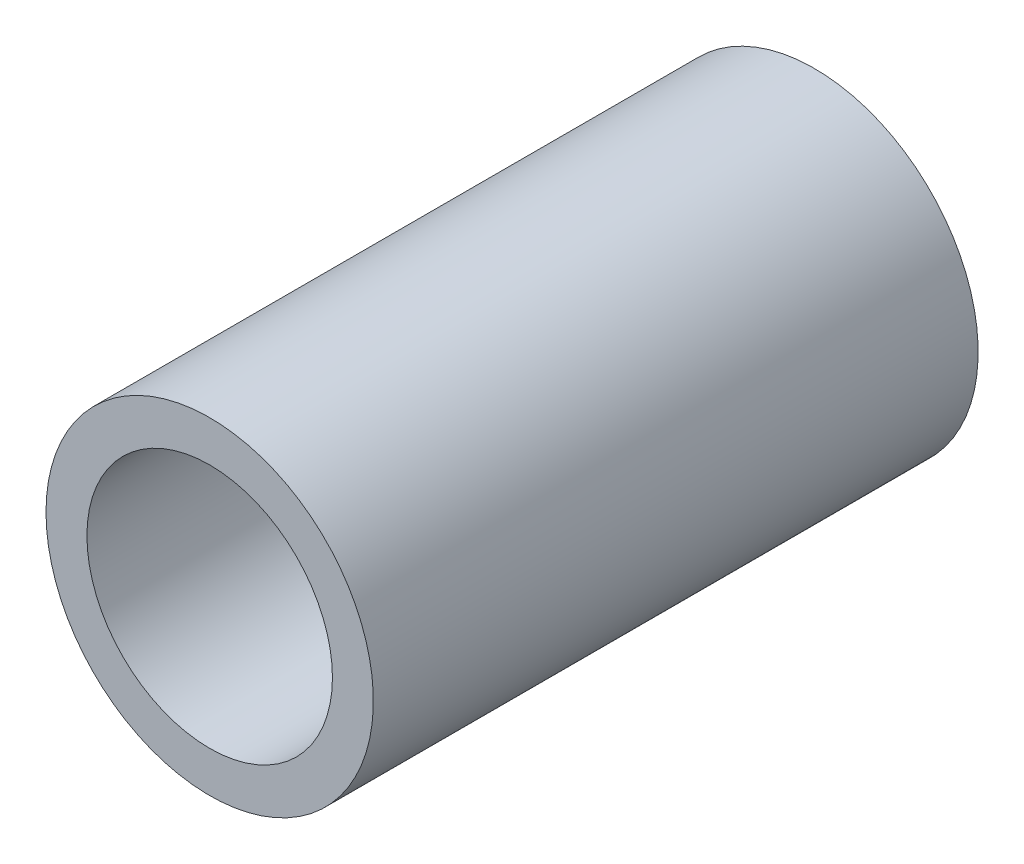
ISO-10303-21;
HEADER;
FILE_DESCRIPTION(('STEP AP214'),'2;1');
FILE_NAME('part.step','',(''),(''),'','','');
FILE_SCHEMA(('AUTOMOTIVE_DESIGN { 1 0 10303 214 1 1 1 1 }'));
ENDSEC;
DATA;
#1=APPLICATION_CONTEXT('core data for automotive mechanical design processes');
#2=APPLICATION_PROTOCOL_DEFINITION('international standard','automotive_design',2000,#1);
#3=PRODUCT_CONTEXT('',#1,'mechanical');
#4=PRODUCT('Part','Part','',(#3));
#5=PRODUCT_RELATED_PRODUCT_CATEGORY('part','',(#4));
#6=PRODUCT_DEFINITION_FORMATION('','',#4);
#7=PRODUCT_DEFINITION_CONTEXT('part definition',#1,'design');
#8=PRODUCT_DEFINITION('design','',#6,#7);
#9=PRODUCT_DEFINITION_SHAPE('','',#8);
#10=(LENGTH_UNIT() NAMED_UNIT(*) SI_UNIT(.MILLI.,.METRE.));
#11=(NAMED_UNIT(*) PLANE_ANGLE_UNIT() SI_UNIT($,.RADIAN.));
#12=(NAMED_UNIT(*) SI_UNIT($,.STERADIAN.) SOLID_ANGLE_UNIT());
#13=UNCERTAINTY_MEASURE_WITH_UNIT(LENGTH_MEASURE(1.E-05),#10,'distance_accuracy_value','');
#14=(GEOMETRIC_REPRESENTATION_CONTEXT(3) GLOBAL_UNCERTAINTY_ASSIGNED_CONTEXT((#13)) GLOBAL_UNIT_ASSIGNED_CONTEXT((#10,
#11,#12)) REPRESENTATION_CONTEXT('',''));
#15=CARTESIAN_POINT('',(0.,0.,0.));
#16=DIRECTION('',(0.,0.,1.));
#17=DIRECTION('',(1.,0.,0.));
#18=AXIS2_PLACEMENT_3D('',#15,#16,#17);
#19=CARTESIAN_POINT('',(0.,0.,14.78));
#20=DIRECTION('',(0.,0.,1.));
#21=DIRECTION('',(1.,0.,0.));
#22=AXIS2_PLACEMENT_3D('',#19,#20,#21);
#23=PLANE('',#22);
#24=CARTESIAN_POINT('',(0.,0.,14.78));
#25=DIRECTION('',(0.,0.,1.));
#26=DIRECTION('',(1.,0.,0.));
#27=AXIS2_PLACEMENT_3D('',#24,#25,#26);
#28=CIRCLE('',#27,4.);
#29=CARTESIAN_POINT('',(-4.,0.,14.78));
#30=VERTEX_POINT('',#29);
#31=EDGE_CURVE('E10',#30,#30,#28,.T.);
#32=ORIENTED_EDGE('',*,*,#31,.T.);
#33=EDGE_LOOP('',(#32));
#34=FACE_BOUND('',#33,.T.);
#35=CARTESIAN_POINT('',(0.,0.,14.78));
#36=DIRECTION('',(0.,0.,1.));
#37=DIRECTION('',(1.,0.,0.));
#38=AXIS2_PLACEMENT_3D('',#35,#36,#37);
#39=CIRCLE('',#38,3.);
#40=CARTESIAN_POINT('',(-3.,0.,14.78));
#41=VERTEX_POINT('',#40);
#42=EDGE_CURVE('E43',#41,#41,#39,.T.);
#43=ORIENTED_EDGE('',*,*,#42,.F.);
#44=EDGE_LOOP('',(#43));
#45=FACE_BOUND('',#44,.T.);
#46=ADVANCED_FACE('F32',(#34,#45),#23,.T.);
#47=CARTESIAN_POINT('',(0.,0.,0.));
#48=DIRECTION('',(0.,0.,1.));
#49=DIRECTION('',(1.,0.,0.));
#50=AXIS2_PLACEMENT_3D('',#47,#48,#49);
#51=PLANE('',#50);
#52=CARTESIAN_POINT('',(0.,0.,0.));
#53=DIRECTION('',(0.,0.,1.));
#54=DIRECTION('',(1.,0.,0.));
#55=AXIS2_PLACEMENT_3D('',#52,#53,#54);
#56=CIRCLE('',#55,4.);
#57=CARTESIAN_POINT('',(-4.,0.,0.));
#58=VERTEX_POINT('',#57);
#59=EDGE_CURVE('E36',#58,#58,#56,.T.);
#60=ORIENTED_EDGE('',*,*,#59,.F.);
#61=EDGE_LOOP('',(#60));
#62=FACE_BOUND('',#61,.T.);
#63=CARTESIAN_POINT('',(0.,0.,0.));
#64=DIRECTION('',(0.,0.,1.));
#65=DIRECTION('',(1.,0.,0.));
#66=AXIS2_PLACEMENT_3D('',#63,#64,#65);
#67=CIRCLE('',#66,3.);
#68=CARTESIAN_POINT('',(-3.,0.,0.));
#69=VERTEX_POINT('',#68);
#70=EDGE_CURVE('E45',#69,#69,#67,.T.);
#71=ORIENTED_EDGE('',*,*,#70,.T.);
#72=EDGE_LOOP('',(#71));
#73=FACE_BOUND('',#72,.T.);
#74=ADVANCED_FACE('F55',(#62,#73),#51,.F.);
#75=CARTESIAN_POINT('',(0.,0.,14.78));
#76=DIRECTION('',(0.,0.,-1.));
#77=DIRECTION('',(-1.,0.,0.));
#78=AXIS2_PLACEMENT_3D('',#75,#76,#77);
#79=CYLINDRICAL_SURFACE('',#78,4.);
#80=CARTESIAN_POINT('',(-4.,0.,14.78));
#81=CARTESIAN_POINT('',(-4.,0.,14.6260416666667));
#82=CARTESIAN_POINT('',(-4.,0.,14.4720833333333));
#83=CARTESIAN_POINT('',(-4.,0.,14.1641666666667));
#84=CARTESIAN_POINT('',(-4.,0.,14.0102083333333));
#85=CARTESIAN_POINT('',(-4.,0.,13.7022916666667));
#86=CARTESIAN_POINT('',(-4.,0.,13.5483333333333));
#87=CARTESIAN_POINT('',(-4.,0.,13.2404166666667));
#88=CARTESIAN_POINT('',(-4.,0.,13.0864583333333));
#89=CARTESIAN_POINT('',(-4.,0.,12.7785416666667));
#90=CARTESIAN_POINT('',(-4.,0.,12.6245833333333));
#91=CARTESIAN_POINT('',(-4.,0.,12.3166666666667));
#92=CARTESIAN_POINT('',(-4.,0.,12.1627083333333));
#93=CARTESIAN_POINT('',(-4.,0.,11.8547916666667));
#94=CARTESIAN_POINT('',(-4.,0.,11.7008333333333));
#95=CARTESIAN_POINT('',(-4.,0.,11.3929166666667));
#96=CARTESIAN_POINT('',(-4.,0.,11.2389583333333));
#97=CARTESIAN_POINT('',(-4.,0.,10.9310416666667));
#98=CARTESIAN_POINT('',(-4.,0.,10.7770833333333));
#99=CARTESIAN_POINT('',(-4.,0.,10.4691666666667));
#100=CARTESIAN_POINT('',(-4.,0.,10.3152083333333));
#101=CARTESIAN_POINT('',(-4.,0.,10.0072916666667));
#102=CARTESIAN_POINT('',(-4.,0.,9.85333333333333));
#103=CARTESIAN_POINT('',(-4.,0.,9.54541666666667));
#104=CARTESIAN_POINT('',(-4.,0.,9.39145833333333));
#105=CARTESIAN_POINT('',(-4.,0.,9.08354166666667));
#106=CARTESIAN_POINT('',(-4.,0.,8.92958333333333));
#107=CARTESIAN_POINT('',(-4.,0.,8.62166666666666));
#108=CARTESIAN_POINT('',(-4.,0.,8.46770833333333));
#109=CARTESIAN_POINT('',(-4.,0.,8.15979166666667));
#110=CARTESIAN_POINT('',(-4.,0.,8.00583333333333));
#111=CARTESIAN_POINT('',(-4.,0.,7.69791666666667));
#112=CARTESIAN_POINT('',(-4.,0.,7.54395833333333));
#113=CARTESIAN_POINT('',(-4.,0.,7.23604166666667));
#114=CARTESIAN_POINT('',(-4.,0.,7.08208333333333));
#115=CARTESIAN_POINT('',(-4.,0.,6.77416666666667));
#116=CARTESIAN_POINT('',(-4.,0.,6.62020833333333));
#117=CARTESIAN_POINT('',(-4.,0.,6.31229166666667));
#118=CARTESIAN_POINT('',(-4.,0.,6.15833333333333));
#119=CARTESIAN_POINT('',(-4.,0.,5.85041666666667));
#120=CARTESIAN_POINT('',(-4.,0.,5.69645833333333));
#121=CARTESIAN_POINT('',(-4.,0.,5.38854166666667));
#122=CARTESIAN_POINT('',(-4.,0.,5.23458333333333));
#123=CARTESIAN_POINT('',(-4.,0.,4.92666666666667));
#124=CARTESIAN_POINT('',(-4.,0.,4.77270833333333));
#125=CARTESIAN_POINT('',(-4.,0.,4.46479166666667));
#126=CARTESIAN_POINT('',(-4.,0.,4.31083333333333));
#127=CARTESIAN_POINT('',(-4.,0.,4.00291666666667));
#128=CARTESIAN_POINT('',(-4.,0.,3.84895833333333));
#129=CARTESIAN_POINT('',(-4.,0.,3.54104166666667));
#130=CARTESIAN_POINT('',(-4.,0.,3.38708333333333));
#131=CARTESIAN_POINT('',(-4.,0.,3.07916666666667));
#132=CARTESIAN_POINT('',(-4.,0.,2.92520833333333));
#133=CARTESIAN_POINT('',(-4.,0.,2.61729166666667));
#134=CARTESIAN_POINT('',(-4.,0.,2.46333333333333));
#135=CARTESIAN_POINT('',(-4.,0.,2.15541666666667));
#136=CARTESIAN_POINT('',(-4.,0.,2.00145833333333));
#137=CARTESIAN_POINT('',(-4.,0.,1.69354166666667));
#138=CARTESIAN_POINT('',(-4.,0.,1.53958333333333));
#139=CARTESIAN_POINT('',(-4.,0.,1.23166666666667));
#140=CARTESIAN_POINT('',(-4.,0.,1.07770833333333));
#141=CARTESIAN_POINT('',(-4.,0.,0.769791666666667));
#142=CARTESIAN_POINT('',(-4.,0.,0.615833333333334));
#143=CARTESIAN_POINT('',(-4.,0.,0.307916666666667));
#144=CARTESIAN_POINT('',(-4.,0.,0.153958333333333));
#145=CARTESIAN_POINT('',(-4.,0.,0.));
#146=B_SPLINE_CURVE_WITH_KNOTS('',3,(#80,#81,#82,#83,#84,#85,#86,#87,#88,#89,#90,#91,#92,#93,
#94,#95,#96,#97,#98,#99,#100,#101,#102,#103,#104,#105,#106,#107,#108,#109,#110,#111,#112,#113,
#114,#115,#116,#117,#118,#119,#120,#121,#122,#123,#124,#125,#126,#127,#128,#129,#130,#131,#132,
#133,#134,#135,#136,#137,#138,#139,#140,#141,#142,#143,#144,#145),.UNSPECIFIED.,.F.,.F.,(4,2,2,
2,2,2,2,2,2,2,2,2,2,2,2,2,2,2,2,2,2,2,2,2,2,2,2,2,2,2,2,2,4),(0.,0.461875,0.923750000000001,
1.385625,1.8475,2.309375,2.77125,3.233125,3.695,4.156875,4.61875,5.080625,5.5425,6.004375,
6.46625,6.928125,7.39,7.851875,8.31375,8.775625,9.2375,9.699375,10.16125,10.623125,11.085,
11.546875,12.00875,12.470625,12.9325,13.394375,13.85625,14.318125,14.78),.UNSPECIFIED.);
#147=EDGE_CURVE('BSEAM34',#30,#58,#146,.T.);
#148=ORIENTED_EDGE('',*,*,#31,.F.);
#149=ORIENTED_EDGE('',*,*,#59,.T.);
#150=ORIENTED_EDGE('',*,*,#147,.T.);
#151=ORIENTED_EDGE('',*,*,#147,.F.);
#152=EDGE_LOOP('',(#148,#150,#149,#151));
#153=FACE_BOUND('',#152,.T.);
#154=ADVANCED_FACE('F34',(#153),#79,.T.);
#155=CARTESIAN_POINT('',(0.,0.,14.78));
#156=DIRECTION('',(0.,0.,-1.));
#157=DIRECTION('',(-1.,0.,0.));
#158=AXIS2_PLACEMENT_3D('',#155,#156,#157);
#159=CYLINDRICAL_SURFACE('',#158,3.);
#160=CARTESIAN_POINT('',(-3.,0.,14.78));
#161=CARTESIAN_POINT('',(-3.,0.,14.6260416666667));
#162=CARTESIAN_POINT('',(-3.,0.,14.4720833333333));
#163=CARTESIAN_POINT('',(-3.,0.,14.1641666666667));
#164=CARTESIAN_POINT('',(-3.,0.,14.0102083333333));
#165=CARTESIAN_POINT('',(-3.,0.,13.7022916666667));
#166=CARTESIAN_POINT('',(-3.,0.,13.5483333333333));
#167=CARTESIAN_POINT('',(-3.,0.,13.2404166666667));
#168=CARTESIAN_POINT('',(-3.,0.,13.0864583333333));
#169=CARTESIAN_POINT('',(-3.,0.,12.7785416666667));
#170=CARTESIAN_POINT('',(-3.,0.,12.6245833333333));
#171=CARTESIAN_POINT('',(-3.,0.,12.3166666666667));
#172=CARTESIAN_POINT('',(-3.,0.,12.1627083333333));
#173=CARTESIAN_POINT('',(-3.,0.,11.8547916666667));
#174=CARTESIAN_POINT('',(-3.,0.,11.7008333333333));
#175=CARTESIAN_POINT('',(-3.,0.,11.3929166666667));
#176=CARTESIAN_POINT('',(-3.,0.,11.2389583333333));
#177=CARTESIAN_POINT('',(-3.,0.,10.9310416666667));
#178=CARTESIAN_POINT('',(-3.,0.,10.7770833333333));
#179=CARTESIAN_POINT('',(-3.,0.,10.4691666666667));
#180=CARTESIAN_POINT('',(-3.,0.,10.3152083333333));
#181=CARTESIAN_POINT('',(-3.,0.,10.0072916666667));
#182=CARTESIAN_POINT('',(-3.,0.,9.85333333333333));
#183=CARTESIAN_POINT('',(-3.,0.,9.54541666666667));
#184=CARTESIAN_POINT('',(-3.,0.,9.39145833333333));
#185=CARTESIAN_POINT('',(-3.,0.,9.08354166666667));
#186=CARTESIAN_POINT('',(-3.,0.,8.92958333333333));
#187=CARTESIAN_POINT('',(-3.,0.,8.62166666666666));
#188=CARTESIAN_POINT('',(-3.,0.,8.46770833333333));
#189=CARTESIAN_POINT('',(-3.,0.,8.15979166666667));
#190=CARTESIAN_POINT('',(-3.,0.,8.00583333333333));
#191=CARTESIAN_POINT('',(-3.,0.,7.69791666666667));
#192=CARTESIAN_POINT('',(-3.,0.,7.54395833333333));
#193=CARTESIAN_POINT('',(-3.,0.,7.23604166666667));
#194=CARTESIAN_POINT('',(-3.,0.,7.08208333333333));
#195=CARTESIAN_POINT('',(-3.,0.,6.77416666666667));
#196=CARTESIAN_POINT('',(-3.,0.,6.62020833333333));
#197=CARTESIAN_POINT('',(-3.,0.,6.31229166666667));
#198=CARTESIAN_POINT('',(-3.,0.,6.15833333333333));
#199=CARTESIAN_POINT('',(-3.,0.,5.85041666666667));
#200=CARTESIAN_POINT('',(-3.,0.,5.69645833333333));
#201=CARTESIAN_POINT('',(-3.,0.,5.38854166666667));
#202=CARTESIAN_POINT('',(-3.,0.,5.23458333333333));
#203=CARTESIAN_POINT('',(-3.,0.,4.92666666666667));
#204=CARTESIAN_POINT('',(-3.,0.,4.77270833333333));
#205=CARTESIAN_POINT('',(-3.,0.,4.46479166666667));
#206=CARTESIAN_POINT('',(-3.,0.,4.31083333333333));
#207=CARTESIAN_POINT('',(-3.,0.,4.00291666666667));
#208=CARTESIAN_POINT('',(-3.,0.,3.84895833333333));
#209=CARTESIAN_POINT('',(-3.,0.,3.54104166666667));
#210=CARTESIAN_POINT('',(-3.,0.,3.38708333333333));
#211=CARTESIAN_POINT('',(-3.,0.,3.07916666666667));
#212=CARTESIAN_POINT('',(-3.,0.,2.92520833333333));
#213=CARTESIAN_POINT('',(-3.,0.,2.61729166666667));
#214=CARTESIAN_POINT('',(-3.,0.,2.46333333333333));
#215=CARTESIAN_POINT('',(-3.,0.,2.15541666666667));
#216=CARTESIAN_POINT('',(-3.,0.,2.00145833333333));
#217=CARTESIAN_POINT('',(-3.,0.,1.69354166666667));
#218=CARTESIAN_POINT('',(-3.,0.,1.53958333333333));
#219=CARTESIAN_POINT('',(-3.,0.,1.23166666666667));
#220=CARTESIAN_POINT('',(-3.,0.,1.07770833333333));
#221=CARTESIAN_POINT('',(-3.,0.,0.769791666666667));
#222=CARTESIAN_POINT('',(-3.,0.,0.615833333333334));
#223=CARTESIAN_POINT('',(-3.,0.,0.307916666666667));
#224=CARTESIAN_POINT('',(-3.,0.,0.153958333333333));
#225=CARTESIAN_POINT('',(-3.,0.,0.));
#226=B_SPLINE_CURVE_WITH_KNOTS('',3,(#160,#161,#162,#163,#164,#165,#166,#167,#168,#169,#170,
#171,#172,#173,#174,#175,#176,#177,#178,#179,#180,#181,#182,#183,#184,#185,#186,#187,#188,#189,
#190,#191,#192,#193,#194,#195,#196,#197,#198,#199,#200,#201,#202,#203,#204,#205,#206,#207,#208,
#209,#210,#211,#212,#213,#214,#215,#216,#217,#218,#219,#220,#221,#222,#223,#224,#225),
.UNSPECIFIED.,.F.,.F.,(4,2,2,2,2,2,2,2,2,2,2,2,2,2,2,2,2,2,2,2,2,2,2,2,2,2,2,2,2,2,2,2,4),(0.,
0.461875,0.923750000000001,1.385625,1.8475,2.309375,2.77125,3.233125,3.695,4.156875,4.61875,
5.080625,5.5425,6.004375,6.46625,6.928125,7.39,7.851875,8.31375,8.775625,9.2375,9.699375,
10.16125,10.623125,11.085,11.546875,12.00875,12.470625,12.9325,13.394375,13.85625,14.318125,
14.78),.UNSPECIFIED.);
#227=EDGE_CURVE('BSEAM51',#41,#69,#226,.T.);
#228=ORIENTED_EDGE('',*,*,#42,.T.);
#229=ORIENTED_EDGE('',*,*,#70,.F.);
#230=ORIENTED_EDGE('',*,*,#227,.T.);
#231=ORIENTED_EDGE('',*,*,#227,.F.);
#232=EDGE_LOOP('',(#228,#230,#229,#231));
#233=FACE_BOUND('',#232,.T.);
#234=ADVANCED_FACE('F51',(#233),#159,.F.);
#235=CLOSED_SHELL('',(#46,#74,#154,#234));
#236=MANIFOLD_SOLID_BREP('B2',#235);
#237=ADVANCED_BREP_SHAPE_REPRESENTATION('',(#18,#236),#14);
#238=SHAPE_DEFINITION_REPRESENTATION(#9,#237);
ENDSEC;
END-ISO-10303-21;
